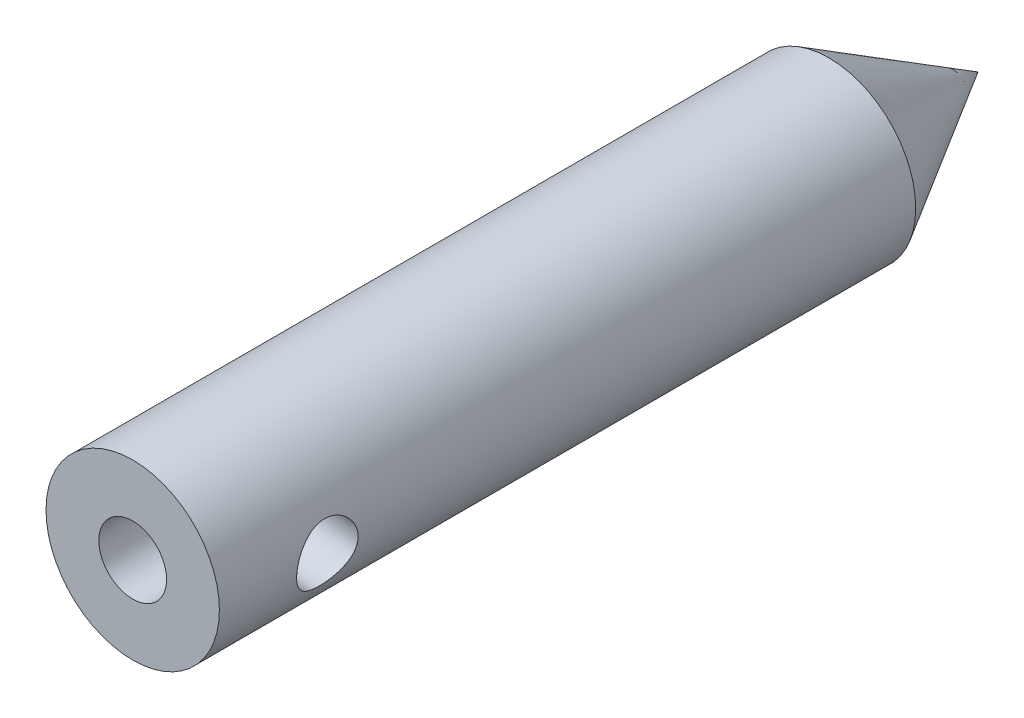
ISO-10303-21;
HEADER;
FILE_DESCRIPTION(('STEP AP214'),'2;1');
FILE_NAME('part.step','',(''),(''),'','','');
FILE_SCHEMA(('AUTOMOTIVE_DESIGN { 1 0 10303 214 1 1 1 1 }'));
ENDSEC;
DATA;
#1=APPLICATION_CONTEXT('core data for automotive mechanical design processes');
#2=APPLICATION_PROTOCOL_DEFINITION('international standard','automotive_design',2000,#1);
#3=PRODUCT_CONTEXT('',#1,'mechanical');
#4=PRODUCT('Part','Part','',(#3));
#5=PRODUCT_RELATED_PRODUCT_CATEGORY('part','',(#4));
#6=PRODUCT_DEFINITION_FORMATION('','',#4);
#7=PRODUCT_DEFINITION_CONTEXT('part definition',#1,'design');
#8=PRODUCT_DEFINITION('design','',#6,#7);
#9=PRODUCT_DEFINITION_SHAPE('','',#8);
#10=(LENGTH_UNIT() NAMED_UNIT(*) SI_UNIT(.MILLI.,.METRE.));
#11=(NAMED_UNIT(*) PLANE_ANGLE_UNIT() SI_UNIT($,.RADIAN.));
#12=(NAMED_UNIT(*) SI_UNIT($,.STERADIAN.) SOLID_ANGLE_UNIT());
#13=UNCERTAINTY_MEASURE_WITH_UNIT(LENGTH_MEASURE(1.E-05),#10,'distance_accuracy_value','');
#14=(GEOMETRIC_REPRESENTATION_CONTEXT(3) GLOBAL_UNCERTAINTY_ASSIGNED_CONTEXT((#13)) GLOBAL_UNIT_ASSIGNED_CONTEXT((#10,
#11,#12)) REPRESENTATION_CONTEXT('',''));
#15=CARTESIAN_POINT('',(0.,0.,0.));
#16=DIRECTION('',(0.,0.,1.));
#17=DIRECTION('',(1.,0.,0.));
#18=AXIS2_PLACEMENT_3D('',#15,#16,#17);
#19=CARTESIAN_POINT('',(0.,0.,25.7));
#20=DIRECTION('',(0.,0.,-1.));
#21=DIRECTION('',(-1.,0.,0.));
#22=AXIS2_PLACEMENT_3D('',#19,#20,#21);
#23=CYLINDRICAL_SURFACE('',#22,3.2);
#24=CARTESIAN_POINT('',(-3.2,0.,22.7944930865436));
#25=CARTESIAN_POINT('',(-3.19999993437462,-0.0617311995361871,22.7786358266463));
#26=CARTESIAN_POINT('',(-3.19819853935474,-0.122137071739955,22.7576172305051));
#27=CARTESIAN_POINT('',(-3.19162977738413,-0.238548511239505,22.7060236217471));
#28=CARTESIAN_POINT('',(-3.18686119831993,-0.294552269708068,22.6754447062204));
#29=CARTESIAN_POINT('',(-3.17527843273258,-0.400558738306911,22.6057548866532));
#30=CARTESIAN_POINT('',(-3.16846834384735,-0.450573191117512,22.5666611158766));
#31=CARTESIAN_POINT('',(-3.15386084267928,-0.543485991389393,22.4809263541348));
#32=CARTESIAN_POINT('',(-3.14606330690951,-0.586383447269194,22.4342844190172));
#33=CARTESIAN_POINT('',(-3.13039055474989,-0.665067091132649,22.333088305801));
#34=CARTESIAN_POINT('',(-3.12251973282401,-0.700608691481398,22.2783426634936));
#35=CARTESIAN_POINT('',(-3.10816086298875,-0.761793206985309,22.1634013496605));
#36=CARTESIAN_POINT('',(-3.1016724958685,-0.787438408345513,22.1032069408469));
#37=CARTESIAN_POINT('',(-3.09127293667315,-0.827314496967705,21.9806264060403));
#38=CARTESIAN_POINT('',(-3.08730040487651,-0.84181905727607,21.9183349377635));
#39=CARTESIAN_POINT('',(-3.08233528176368,-0.859825879396913,21.7920745340401));
#40=CARTESIAN_POINT('',(-3.08134138080551,-0.863332976596517,21.7281063482946));
#41=CARTESIAN_POINT('',(-3.08246406346741,-0.859311185365296,21.6042337795584));
#42=CARTESIAN_POINT('',(-3.08440571866578,-0.852403005411055,21.5443065241799));
#43=CARTESIAN_POINT('',(-3.09078530260908,-0.828970202868143,21.4265058328426));
#44=CARTESIAN_POINT('',(-3.09522342584251,-0.812444831044213,21.3686325572735));
#45=CARTESIAN_POINT('',(-3.10597350952847,-0.770323802041542,21.2562449227704));
#46=CARTESIAN_POINT('',(-3.11229233295177,-0.744694857062636,21.2017437646356));
#47=CARTESIAN_POINT('',(-3.12592915432085,-0.685197682497173,21.0975783194097));
#48=CARTESIAN_POINT('',(-3.13324744667341,-0.651327022898214,21.0479154649175));
#49=CARTESIAN_POINT('',(-3.1483480530381,-0.574055598485578,20.9517557542217));
#50=CARTESIAN_POINT('',(-3.15613250835144,-0.530213820713868,20.9056131265984));
#51=CARTESIAN_POINT('',(-3.17059430050408,-0.435461013309089,20.8210393995617));
#52=CARTESIAN_POINT('',(-3.17727140895548,-0.38454852932673,20.7826098906198));
#53=CARTESIAN_POINT('',(-3.1885912645528,-0.275598417571499,20.7136522421497));
#54=CARTESIAN_POINT('',(-3.19317936010695,-0.217415219203771,20.6833440767924));
#55=CARTESIAN_POINT('',(-3.1991112530944,-0.0966241449688731,20.6329487387164));
#56=CARTESIAN_POINT('',(-3.20045616205574,-0.0340177926106655,20.6128580660491));
#57=CARTESIAN_POINT('',(-3.19929055922512,0.0910175946912793,20.5842874323287));
#58=CARTESIAN_POINT('',(-3.19693828204112,0.153345424552418,20.5753587650775));
#59=CARTESIAN_POINT('',(-3.18848501342895,0.278359729081188,20.5679679509808));
#60=CARTESIAN_POINT('',(-3.18238500538007,0.341046105395387,20.5695030595774));
#61=CARTESIAN_POINT('',(-3.16700139244355,0.462258711908021,20.5826871237017));
#62=CARTESIAN_POINT('',(-3.15786019470076,0.520849687917561,20.5939143154701));
#63=CARTESIAN_POINT('',(-3.13689964178176,0.635004369378329,20.6255053466198));
#64=CARTESIAN_POINT('',(-3.12508005555157,0.690567813143055,20.6458699744002));
#65=CARTESIAN_POINT('',(-3.09933482922577,0.798277511701459,20.6955168321471));
#66=CARTESIAN_POINT('',(-3.08537536577957,0.850345077853432,20.7249517345687));
#67=CARTESIAN_POINT('',(-3.05652989226255,0.948821341350156,20.7917674595073));
#68=CARTESIAN_POINT('',(-3.04164359398435,0.995228265059911,20.8291507624641));
#69=CARTESIAN_POINT('',(-3.0112921146253,1.08370781758369,20.9131103059363));
#70=CARTESIAN_POINT('',(-2.9958376692271,1.12542408337298,20.9600666542337));
#71=CARTESIAN_POINT('',(-2.96651754674407,1.20058543509738,21.060642721257));
#72=CARTESIAN_POINT('',(-2.95265212244238,1.23402920601284,21.1142634973467));
#73=CARTESIAN_POINT('',(-2.92769089356362,1.29214701601769,21.2276174202286));
#74=CARTESIAN_POINT('',(-2.91663423985142,1.3166989257288,21.2874221707784));
#75=CARTESIAN_POINT('',(-2.89877088714497,1.35557786060711,21.4108621533135));
#76=CARTESIAN_POINT('',(-2.89196205397636,1.3699100208615,21.4744954441289));
#77=CARTESIAN_POINT('',(-2.88364418953838,1.38733004175428,21.6001999775739));
#78=CARTESIAN_POINT('',(-2.88187566616754,1.39096876620615,21.6621778168701));
#79=CARTESIAN_POINT('',(-2.88309752691007,1.38843478184487,21.7858784148954));
#80=CARTESIAN_POINT('',(-2.88608708923591,1.38226376731019,21.8476012158273));
#81=CARTESIAN_POINT('',(-2.89628825905857,1.36075206820785,21.9667208111054));
#82=CARTESIAN_POINT('',(-2.90334311256881,1.34575140877667,22.024193322917));
#83=CARTESIAN_POINT('',(-2.92083743506208,1.30734507475733,22.1357075380328));
#84=CARTESIAN_POINT('',(-2.93127759121062,1.28393769362726,22.1897485421269));
#85=CARTESIAN_POINT('',(-2.95503830666448,1.22828964600742,22.295161957122));
#86=CARTESIAN_POINT('',(-2.96845441682057,1.19574315255556,22.3463510961575));
#87=CARTESIAN_POINT('',(-2.99671720877177,1.12303399840695,22.4425632498667));
#88=CARTESIAN_POINT('',(-3.01156435693581,1.08286885066865,22.4875842427154));
#89=CARTESIAN_POINT('',(-3.04227019348381,0.993448266173681,22.5726429211006));
#90=CARTESIAN_POINT('',(-3.05814075819324,0.943823613467417,22.6122895132291));
#91=CARTESIAN_POINT('',(-3.08875996925875,0.838200922665374,22.6825043902758));
#92=CARTESIAN_POINT('',(-3.10350866708314,0.782203177244866,22.7130730918508));
#93=CARTESIAN_POINT('',(-3.1305265635633,0.665831760461699,22.7638694098452));
#94=CARTESIAN_POINT('',(-3.14281925471979,0.605507882388082,22.7841981482272));
#95=CARTESIAN_POINT('',(-3.16415499540695,0.48172521913387,22.8141855420875));
#96=CARTESIAN_POINT('',(-3.1731996810385,0.41826803065573,22.8238495747427));
#97=CARTESIAN_POINT('',(-3.18692490150107,0.295060909785404,22.8318018901157));
#98=CARTESIAN_POINT('',(-3.19188323859494,0.23539253871287,22.8308935109131));
#99=CARTESIAN_POINT('',(-3.19842090894103,0.116762117797029,22.8196630891429));
#100=CARTESIAN_POINT('',(-3.2000000614463,0.0578001059034239,22.8093405430694));
#101=CARTESIAN_POINT('',(-3.2,0.,22.7944930865436));
#102=B_SPLINE_CURVE_WITH_KNOTS('',3,(#24,#25,#26,#27,#28,#29,#30,#31,#32,#33,#34,#35,#36,#37,
#38,#39,#40,#41,#42,#43,#44,#45,#46,#47,#48,#49,#50,#51,#52,#53,#54,#55,#56,#57,#58,#59,#60,#61,
#62,#63,#64,#65,#66,#67,#68,#69,#70,#71,#72,#73,#74,#75,#76,#77,#78,#79,#80,#81,#82,#83,#84,#85,
#86,#87,#88,#89,#90,#91,#92,#93,#94,#95,#96,#97,#98,#99,#100,#101),.UNSPECIFIED.,.T.,.F.,(4,2,2,
2,2,2,2,2,2,2,2,2,2,2,2,2,2,2,2,2,2,2,2,2,2,2,2,2,2,2,2,2,2,2,2,2,2,2,4),(0.,0.190977205855533,
0.382032478372898,0.57270681105123,0.763405012441077,0.95967878911354,1.15590719664651,
1.34714568263114,1.53830007268784,1.71850380909875,1.89872158630996,2.07960524236998,
2.26054229548255,2.452045187326,2.64358752724091,2.83988762588546,3.03612043759161,
3.22418070953734,3.4121916567994,3.5924112515756,3.77264639910621,3.95609834539072,
4.13960762536492,4.33276914089114,4.52596134222482,4.72171451983427,4.91736926848248,
5.1027513171588,5.2881013512532,5.46674178471483,5.6454185022201,5.83098548451374,
6.01661314806614,6.21208885865324,6.40755559591435,6.60105223348223,6.7944512648223,
6.9732573211079,7.15207294119186),.UNSPECIFIED.);
#103=CARTESIAN_POINT('',(-3.2,0.,22.7944930865436));
#104=VERTEX_POINT('',#103);
#105=EDGE_CURVE('E75',#104,#104,#102,.T.);
#106=ORIENTED_EDGE('',*,*,#105,.T.);
#107=EDGE_LOOP('',(#106));
#108=FACE_BOUND('',#107,.T.);
#109=CARTESIAN_POINT('',(3.08175738840726,0.861841864263549,21.7));
#110=CARTESIAN_POINT('',(3.08175651484368,0.861843082405382,21.6386760540217));
#111=CARTESIAN_POINT('',(3.0832130952027,0.856685954913348,21.5773600067072));
#112=CARTESIAN_POINT('',(3.08880716141158,0.836289524152194,21.4565595393788));
#113=CARTESIAN_POINT('',(3.09294482899364,0.821049537434951,21.3970752438128));
#114=CARTESIAN_POINT('',(3.10326177903859,0.781143862734923,21.2817111821773));
#115=CARTESIAN_POINT('',(3.10943665156178,0.756498516638581,21.2258239391545));
#116=CARTESIAN_POINT('',(3.12295049471786,0.698613320374679,21.1188497730618));
#117=CARTESIAN_POINT('',(3.13028976842011,0.66537123123106,21.0677641052696));
#118=CARTESIAN_POINT('',(3.14543241805791,0.589743524332679,20.9695953851951));
#119=CARTESIAN_POINT('',(3.15324261776567,0.547045485797451,20.9227540086867));
#120=CARTESIAN_POINT('',(3.16790690227465,0.454487711054366,20.8365857898212));
#121=CARTESIAN_POINT('',(3.17476081127782,0.404626661457193,20.7972603286492));
#122=CARTESIAN_POINT('',(3.18661796924716,0.297414806317181,20.7261126283346));
#123=CARTESIAN_POINT('',(3.1915601899945,0.239885501159348,20.6945480012759));
#124=CARTESIAN_POINT('',(3.19830374672694,0.120168488347503,20.6415313132755));
#125=CARTESIAN_POINT('',(3.2001060410874,0.0579822081521657,20.6200761681542));
#126=CARTESIAN_POINT('',(3.19988852387152,-0.0666806165956281,20.5887199582199));
#127=CARTESIAN_POINT('',(3.19801391071963,-0.129052816809735,20.578403931468));
#128=CARTESIAN_POINT('',(3.19048783013912,-0.254412317946334,20.5682946512064));
#129=CARTESIAN_POINT('',(3.18483745387257,-0.31739943598244,20.5684983588838));
#130=CARTESIAN_POINT('',(3.17027575467168,-0.439266454247826,20.5791695195987));
#131=CARTESIAN_POINT('',(3.16151874481908,-0.498205170092249,20.589185268122));
#132=CARTESIAN_POINT('',(3.14123375834802,-0.613240233183084,20.6184432797793));
#133=CARTESIAN_POINT('',(3.12970558904291,-0.669336382449154,20.6376861845965));
#134=CARTESIAN_POINT('',(3.1044790226849,-0.778055375884831,20.6850903895635));
#135=CARTESIAN_POINT('',(3.09075270342633,-0.830619147941358,20.7133718622437));
#136=CARTESIAN_POINT('',(3.06224106563081,-0.930252136569935,20.7779482154699));
#137=CARTESIAN_POINT('',(3.04745542973491,-0.977319695339985,20.8142455043005));
#138=CARTESIAN_POINT('',(3.01715685197422,-1.06730348145129,20.8960539447098));
#139=CARTESIAN_POINT('',(3.00164643496536,-1.10987252454041,20.9419484880106));
#140=CARTESIAN_POINT('',(2.97202992939442,-1.18690580512679,21.0405136205239));
#141=CARTESIAN_POINT('',(2.95792411651655,-1.22136845336822,21.0931855353115));
#142=CARTESIAN_POINT('',(2.93223392033621,-1.28183724834896,21.2050300491524));
#143=CARTESIAN_POINT('',(2.920698676606,-1.30768262652924,21.2643013484166));
#144=CARTESIAN_POINT('',(2.90174999125296,-1.34921246366281,21.3869186074051));
#145=CARTESIAN_POINT('',(2.89433456421745,-1.36490181758726,21.4502625879818));
#146=CARTESIAN_POINT('',(2.88476400353687,-1.38501090489278,21.5758415114767));
#147=CARTESIAN_POINT('',(2.88236479086314,-1.38995404349595,21.6379740049359));
#148=CARTESIAN_POINT('',(2.88237124990035,-1.38994134660641,21.7622302915165));
#149=CARTESIAN_POINT('',(2.88477590526623,-1.38498760497747,21.8243540836978));
#150=CARTESIAN_POINT('',(2.89391683871263,-1.36577787972471,21.9442182719182));
#151=CARTESIAN_POINT('',(2.90047502604213,-1.3519040092387,22.0020344760025));
#152=CARTESIAN_POINT('',(2.91708503075749,-1.31567822732537,22.1144123072732));
#153=CARTESIAN_POINT('',(2.92713751368792,-1.29332470073759,22.1689733121335));
#154=CARTESIAN_POINT('',(2.95019703698298,-1.23984314323117,22.2753839083478));
#155=CARTESIAN_POINT('',(2.96329414196464,-1.20843868677343,22.3270747356906));
#156=CARTESIAN_POINT('',(2.99106263265583,-1.1379703566587,22.4244743776935));
#157=CARTESIAN_POINT('',(3.00573453532804,-1.09890396429642,22.4701812169781));
#158=CARTESIAN_POINT('',(3.03627080321124,-1.01158820402906,22.5569217179418));
#159=CARTESIAN_POINT('',(3.05215634041624,-0.962951590751447,22.5975593810468));
#160=CARTESIAN_POINT('',(3.08297718970855,-0.859172600362135,22.6699287754973));
#161=CARTESIAN_POINT('',(3.09791252116956,-0.804030355958935,22.7016606884669));
#162=CARTESIAN_POINT('',(3.12552116627324,-0.688910796748778,22.7550567774161));
#163=CARTESIAN_POINT('',(3.13820632465569,-0.628961368318542,22.7767746964759));
#164=CARTESIAN_POINT('',(3.16041415078533,-0.505666373803693,22.8095656412664));
#165=CARTESIAN_POINT('',(3.16993811665709,-0.442322214187098,22.8206430400104));
#166=CARTESIAN_POINT('',(3.18478881933238,-0.317583447168468,22.8314078385437));
#167=CARTESIAN_POINT('',(3.19030905593031,-0.256260194735239,22.8316607489226));
#168=CARTESIAN_POINT('',(3.197770478114,-0.134175289035274,22.8221920750222));
#169=CARTESIAN_POINT('',(3.19971201648498,-0.0734135809995753,22.8124714740707));
#170=CARTESIAN_POINT('',(3.20022319878396,0.0445963469499583,22.7837187288366));
#171=CARTESIAN_POINT('',(3.19885832310255,0.101890135990527,22.7648732283553));
#172=CARTESIAN_POINT('',(3.19340284319112,0.212748042773136,22.718584005752));
#173=CARTESIAN_POINT('',(3.18931173011346,0.266311462186147,22.6911386789935));
#174=CARTESIAN_POINT('',(3.17893269478324,0.370451616002724,22.627185157032));
#175=CARTESIAN_POINT('',(3.17256425085249,0.420826299481625,22.5903613185513));
#176=CARTESIAN_POINT('',(3.15865380416557,0.51495035262644,22.5092141501746));
#177=CARTESIAN_POINT('',(3.15111140465341,0.558697472507269,22.4648882844113));
#178=CARTESIAN_POINT('',(3.13557744739972,0.640279971905827,22.3675950344792));
#179=CARTESIAN_POINT('',(3.12758104498168,0.677756746041393,22.3143266681999));
#180=CARTESIAN_POINT('',(3.11270606324092,0.743093987218485,22.2020344838641));
#181=CARTESIAN_POINT('',(3.10582737001609,0.770955434452476,22.1430112532491));
#182=CARTESIAN_POINT('',(3.09431911694055,0.815923107651521,22.0210602219681));
#183=CARTESIAN_POINT('',(3.0896800784879,0.833074751477367,21.9581501704255));
#184=CARTESIAN_POINT('',(3.08340038562456,0.856030804361394,21.8301564204081));
#185=CARTESIAN_POINT('',(3.08175831538722,0.861840571635167,21.7650737631205));
#186=CARTESIAN_POINT('',(3.08175738840726,0.861841864263549,21.7));
#187=B_SPLINE_CURVE_WITH_KNOTS('',3,(#109,#110,#111,#112,#113,#114,#115,#116,#117,#118,#119,
#120,#121,#122,#123,#124,#125,#126,#127,#128,#129,#130,#131,#132,#133,#134,#135,#136,#137,#138,
#139,#140,#141,#142,#143,#144,#145,#146,#147,#148,#149,#150,#151,#152,#153,#154,#155,#156,#157,
#158,#159,#160,#161,#162,#163,#164,#165,#166,#167,#168,#169,#170,#171,#172,#173,#174,#175,#176,
#177,#178,#179,#180,#181,#182,#183,#184,#185,#186),.UNSPECIFIED.,.T.,.F.,(4,2,2,2,2,2,2,2,2,2,2,
2,2,2,2,2,2,2,2,2,2,2,2,2,2,2,2,2,2,2,2,2,2,2,2,2,2,2,4),(0.,0.183730233687756,
0.367472922468562,0.550820444792281,0.734215767179361,0.924943140537105,1.11570552986403,
1.31213507037702,1.50850464571413,1.69727566748511,1.88599215968361,2.0664105346041,
2.24684145816109,2.42977875218454,2.61277108313774,2.80536063593982,2.99798791444409,
3.19403050154351,3.38997853011214,3.57614637318476,3.76227483325858,3.94091790598937,
4.11959502281621,4.3044441952815,4.48935423530429,4.68444786797143,4.87953752160763,
5.07356762011039,5.26751794246732,5.45132251056732,5.63510895839098,5.81528554523096,
5.99549577115094,6.18283689090832,6.37024146345261,6.56615501045664,6.76204858000725,
6.9571056642547,7.15207057582932),.UNSPECIFIED.);
#188=CARTESIAN_POINT('',(3.08175738840726,0.861841864263549,21.7));
#189=VERTEX_POINT('',#188);
#190=EDGE_CURVE('E79',#189,#189,#187,.T.);
#191=ORIENTED_EDGE('',*,*,#190,.T.);
#192=EDGE_LOOP('',(#191));
#193=FACE_BOUND('',#192,.T.);
#194=CARTESIAN_POINT('',(0.,0.,25.7));
#195=DIRECTION('',(0.,0.,1.));
#196=DIRECTION('',(1.,0.,0.));
#197=AXIS2_PLACEMENT_3D('',#194,#195,#196);
#198=CIRCLE('',#197,3.2);
#199=CARTESIAN_POINT('',(3.2,0.,25.7));
#200=VERTEX_POINT('',#199);
#201=EDGE_CURVE('E11',#200,#200,#198,.T.);
#202=ORIENTED_EDGE('',*,*,#201,.F.);
#203=EDGE_LOOP('',(#202));
#204=FACE_BOUND('',#203,.T.);
#205=CARTESIAN_POINT('',(0.,0.,0.));
#206=DIRECTION('',(0.,0.,-1.));
#207=DIRECTION('',(-1.,0.,0.));
#208=AXIS2_PLACEMENT_3D('',#205,#206,#207);
#209=CIRCLE('',#208,3.2);
#210=CARTESIAN_POINT('',(-3.2,0.,0.));
#211=VERTEX_POINT('',#210);
#212=EDGE_CURVE('E83',#211,#211,#209,.T.);
#213=ORIENTED_EDGE('',*,*,#212,.F.);
#214=EDGE_LOOP('',(#213));
#215=FACE_BOUND('',#214,.T.);
#216=ADVANCED_FACE('F32',(#108,#193,#204,#215),#23,.T.);
#217=CARTESIAN_POINT('',(0.,0.,25.7));
#218=DIRECTION('',(0.,0.,1.));
#219=DIRECTION('',(1.,0.,0.));
#220=AXIS2_PLACEMENT_3D('',#217,#218,#219);
#221=PLANE('',#220);
#222=CARTESIAN_POINT('',(0.,0.,25.7));
#223=DIRECTION('',(0.,0.,1.));
#224=DIRECTION('',(1.,0.,0.));
#225=AXIS2_PLACEMENT_3D('',#222,#223,#224);
#226=CIRCLE('',#225,1.25);
#227=CARTESIAN_POINT('',(1.25,0.,25.7));
#228=VERTEX_POINT('',#227);
#229=EDGE_CURVE('E45',#228,#228,#226,.F.);
#230=ORIENTED_EDGE('',*,*,#229,.T.);
#231=EDGE_LOOP('',(#230));
#232=FACE_BOUND('',#231,.T.);
#233=ORIENTED_EDGE('',*,*,#201,.T.);
#234=EDGE_LOOP('',(#233));
#235=FACE_BOUND('',#234,.T.);
#236=ADVANCED_FACE('F66',(#232,#235),#221,.T.);
#237=CARTESIAN_POINT('',(0.,0.,25.700012));
#238=DIRECTION('',(0.,0.,-1.));
#239=DIRECTION('',(-1.,0.,0.));
#240=AXIS2_PLACEMENT_3D('',#237,#238,#239);
#241=CYLINDRICAL_SURFACE('',#240,1.25);
#242=CARTESIAN_POINT('',(-1.25,0.,22.8249099896932));
#243=CARTESIAN_POINT('',(-1.24999766705177,-0.0551815359045936,22.8195204038883));
#244=CARTESIAN_POINT('',(-1.24631458752326,-0.10998161058515,22.8101060728636));
#245=CARTESIAN_POINT('',(-1.23222070007497,-0.216917236866035,22.7840040048006));
#246=CARTESIAN_POINT('',(-1.22180180909992,-0.269049505848772,22.7673075369527));
#247=CARTESIAN_POINT('',(-1.19542795355947,-0.368916341536385,22.7279366486313));
#248=CARTESIAN_POINT('',(-1.17952026239871,-0.416684192210315,22.7053136596687));
#249=CARTESIAN_POINT('',(-1.1433121349507,-0.507680268432885,22.6551062965214));
#250=CARTESIAN_POINT('',(-1.12301056603782,-0.550907319207746,22.627520643403));
#251=CARTESIAN_POINT('',(-1.06883916382848,-0.651699754722712,22.5544083964047));
#252=CARTESIAN_POINT('',(-1.03306187372302,-0.706527168929677,22.5065215034988));
#253=CARTESIAN_POINT('',(-0.957505728082901,-0.805967660243836,22.4036472737409));
#254=CARTESIAN_POINT('',(-0.917716611536683,-0.850553537474866,22.3486416220338));
#255=CARTESIAN_POINT('',(-0.846212211626877,-0.921082045542983,22.2442197704254));
#256=CARTESIAN_POINT('',(-0.81455721966739,-0.948973509713359,22.1960577573116));
#257=CARTESIAN_POINT('',(-0.753777340604263,-0.997902681526937,22.0949041169427));
#258=CARTESIAN_POINT('',(-0.724644382042338,-1.01896289492468,22.0419291002113));
#259=CARTESIAN_POINT('',(-0.686834507212692,-1.04451197747982,21.9572805503099));
#260=CARTESIAN_POINT('',(-0.675136157478509,-1.05206062279447,21.9279157932406));
#261=CARTESIAN_POINT('',(-0.65518982991599,-1.06459541311981,21.8675284126356));
#262=CARTESIAN_POINT('',(-0.646933595489726,-1.06958769672087,21.8365099599613));
#263=CARTESIAN_POINT('',(-0.635225578203529,-1.07658750869035,21.7726860933086));
#264=CARTESIAN_POINT('',(-0.631848426229311,-1.07854870415682,21.7398607349414));
#265=CARTESIAN_POINT('',(-0.631029163409725,-1.07902868568066,21.6741208926836));
#266=CARTESIAN_POINT('',(-0.633584298561767,-1.07754906909872,21.6412064572318));
#267=CARTESIAN_POINT('',(-0.644376433095751,-1.07112862028581,21.5738278383874));
#268=CARTESIAN_POINT('',(-0.653080143199619,-1.0659029212663,21.5394714456879));
#269=CARTESIAN_POINT('',(-0.67474341746402,-1.05232383591715,21.4727243674744));
#270=CARTESIAN_POINT('',(-0.687721088784408,-1.04395712080921,21.4403427524034));
#271=CARTESIAN_POINT('',(-0.728310599826002,-1.0163949350346,21.3507099683483));
#272=CARTESIAN_POINT('',(-0.758953322673008,-0.994054547464156,21.2958441999379));
#273=CARTESIAN_POINT('',(-0.822623653338357,-0.942079333215525,21.1912857511815));
#274=CARTESIAN_POINT('',(-0.855656082107026,-0.912429453208225,21.1416040513921));
#275=CARTESIAN_POINT('',(-0.925080849678809,-0.842280040854744,21.041195730931));
#276=CARTESIAN_POINT('',(-0.96141521214483,-0.800917960426087,20.9910242937395));
#277=CARTESIAN_POINT('',(-1.03071191595909,-0.709522206207142,20.8966831135723));
#278=CARTESIAN_POINT('',(-1.06367956568855,-0.659502529520231,20.852503885267));
#279=CARTESIAN_POINT('',(-1.11821274258195,-0.560940029469903,20.7789870943652));
#280=CARTESIAN_POINT('',(-1.14075785688939,-0.51386575323452,20.7484186150589));
#281=CARTESIAN_POINT('',(-1.18056989380048,-0.414270817208163,20.6932471239372));
#282=CARTESIAN_POINT('',(-1.19784258667666,-0.361756196420525,20.6686375966376));
#283=CARTESIAN_POINT('',(-1.2233553367811,-0.26104738559215,20.6301821987639));
#284=CARTESIAN_POINT('',(-1.23260562646096,-0.213532403749094,20.6152382652744));
#285=CARTESIAN_POINT('',(-1.2455443487052,-0.116274672979407,20.591363773337));
#286=CARTESIAN_POINT('',(-1.24923643525018,-0.0665334097874841,20.5824292664122));
#287=CARTESIAN_POINT('',(-1.25055180864942,0.0339947629999644,20.5711613870473));
#288=CARTESIAN_POINT('',(-1.24815049612079,0.0847850873840869,20.5688548521826));
#289=CARTESIAN_POINT('',(-1.23719125384526,0.185541355831951,20.5710995128356));
#290=CARTESIAN_POINT('',(-1.22863331752434,0.235507299015362,20.5756507156762));
#291=CARTESIAN_POINT('',(-1.20659301851028,0.329897469331721,20.5907572931726));
#292=CARTESIAN_POINT('',(-1.1934630529368,0.374471390087605,20.6009073738735));
#293=CARTESIAN_POINT('',(-1.16295014611513,0.460583600594371,20.6263096035679));
#294=CARTESIAN_POINT('',(-1.14556586769604,0.502120930574595,20.641563357249));
#295=CARTESIAN_POINT('',(-1.10073142833747,0.595321086967081,20.6825127822406));
#296=CARTESIAN_POINT('',(-1.07187861929662,0.645524441063555,20.7099952942883));
#297=CARTESIAN_POINT('',(-1.0098097292542,0.738879285903796,20.7713246194994));
#298=CARTESIAN_POINT('',(-0.976584195876116,0.782015031880081,20.8051852905369));
#299=CARTESIAN_POINT('',(-0.89663437233689,0.873679325026911,20.8894385050212));
#300=CARTESIAN_POINT('',(-0.848946309894067,0.91965134437438,20.9416842151007));
#301=CARTESIAN_POINT('',(-0.752444164753941,1.00012690507553,21.0534339068907));
#302=CARTESIAN_POINT('',(-0.703629566698305,1.03462508161267,21.1129412662005));
#303=CARTESIAN_POINT('',(-0.628119406798204,1.08124612936344,21.2145037341198));
#304=CARTESIAN_POINT('',(-0.60030044328334,1.09682546268303,21.2541726640534));
#305=CARTESIAN_POINT('',(-0.547762235956309,1.1239744216787,21.3368251302961));
#306=CARTESIAN_POINT('',(-0.523037490070496,1.13555123110659,21.3798025571331));
#307=CARTESIAN_POINT('',(-0.487508246768452,1.15111873232478,21.4540740108946));
#308=CARTESIAN_POINT('',(-0.474857994912563,1.15634677627243,21.4842058449939));
#309=CARTESIAN_POINT('',(-0.453772050816169,1.16478360190095,21.5461689545842));
#310=CARTESIAN_POINT('',(-0.445324758555755,1.16799794775114,21.5779952811764));
#311=CARTESIAN_POINT('',(-0.435008771962641,1.17187663048995,21.6380480250995));
#312=CARTESIAN_POINT('',(-0.432354346035139,1.17284683619345,21.666114181722));
#313=CARTESIAN_POINT('',(-0.431722399989004,1.1730797135664,21.7222965252052));
#314=CARTESIAN_POINT('',(-0.433742888637079,1.17234311223312,21.7504126856699));
#315=CARTESIAN_POINT('',(-0.443039533160738,1.16886447477694,21.8122532136299));
#316=CARTESIAN_POINT('',(-0.451416139902315,1.16570072066343,21.8457826071132));
#317=CARTESIAN_POINT('',(-0.472918231355275,1.15714364798838,21.9110272723145));
#318=CARTESIAN_POINT('',(-0.486063458868387,1.15174104683202,21.9427343577707));
#319=CARTESIAN_POINT('',(-0.527330597543005,1.13368837816508,22.0294741713973));
#320=CARTESIAN_POINT('',(-0.558900664743808,1.1187265978726,22.082340795947));
#321=CARTESIAN_POINT('',(-0.625918369164334,1.08268294605707,22.1832255445707));
#322=CARTESIAN_POINT('',(-0.661374748686938,1.06158709222973,22.2312322498461));
#323=CARTESIAN_POINT('',(-0.737881548812778,1.01015391677746,22.3288485576972));
#324=CARTESIAN_POINT('',(-0.779079163901509,0.978993417558039,22.3779146268742));
#325=CARTESIAN_POINT('',(-0.860327149717558,0.908424640720194,22.4706984641354));
#326=CARTESIAN_POINT('',(-0.900378931724004,0.869027053716868,22.5144230493296));
#327=CARTESIAN_POINT('',(-0.97276026413447,0.786689134235327,22.5908528321253));
#328=CARTESIAN_POINT('',(-1.00544411813692,0.74470971624516,22.624249176284));
#329=CARTESIAN_POINT('',(-1.06672350965243,0.653904362061103,22.6850069755893));
#330=CARTESIAN_POINT('',(-1.09532307349607,0.605085263890362,22.7123743887593));
#331=CARTESIAN_POINT('',(-1.14206672423938,0.510348763706111,22.7553522592062));
#332=CARTESIAN_POINT('',(-1.16116577076797,0.465463427798125,22.7721885931444));
#333=CARTESIAN_POINT('',(-1.19434807994418,0.372125084595156,22.7998452463546));
#334=CARTESIAN_POINT('',(-1.20843663158791,0.323675904845339,22.8106719161423));
#335=CARTESIAN_POINT('',(-1.22960460238112,0.229479954522564,22.824830236892));
#336=CARTESIAN_POINT('',(-1.23725059961336,0.183958532334338,22.8288114697595));
#337=CARTESIAN_POINT('',(-1.24744952145044,0.0922032111454693,22.8310965363696));
#338=CARTESIAN_POINT('',(-1.25000194347367,0.0459692422915582,22.8293998099138));
#339=CARTESIAN_POINT('',(-1.25,0.,22.8249099896932));
#340=B_SPLINE_CURVE_WITH_KNOTS('',3,(#242,#243,#244,#245,#246,#247,#248,#249,#250,#251,#252,
#253,#254,#255,#256,#257,#258,#259,#260,#261,#262,#263,#264,#265,#266,#267,#268,#269,#270,#271,
#272,#273,#274,#275,#276,#277,#278,#279,#280,#281,#282,#283,#284,#285,#286,#287,#288,#289,#290,
#291,#292,#293,#294,#295,#296,#297,#298,#299,#300,#301,#302,#303,#304,#305,#306,#307,#308,#309,
#310,#311,#312,#313,#314,#315,#316,#317,#318,#319,#320,#321,#322,#323,#324,#325,#326,#327,#328,
#329,#330,#331,#332,#333,#334,#335,#336,#337,#338,#339),.UNSPECIFIED.,.T.,.F.,(4,2,2,2,2,2,2,2,
2,2,2,2,2,2,2,2,2,2,2,2,2,2,2,2,2,2,2,2,2,2,2,2,2,2,2,2,2,2,2,2,2,2,2,2,2,2,2,2,4),(0.,
0.166119742557825,0.332439201768996,0.497360551577222,0.662324464494653,0.904368503787049,
1.14704812638669,1.3387342439515,1.5297822758309,1.62704728011914,1.72407761361462,
1.82257696712857,1.92103060248627,2.02789432790832,2.13521674739339,2.33421919590065,
2.53363494911415,2.75633227386186,2.97867286129757,3.15949282853911,3.34011418634298,
3.49146173712479,3.64270974802504,3.79456932594541,3.94642906602115,4.08851480395392,
4.23064525826977,4.42187803435475,4.6135311986982,4.86533567105296,5.11725771446983,
5.26971162741216,5.42189047721458,5.52091734142743,5.61966935754279,5.70387550421574,
5.7880457907225,5.89154667208534,5.99548104657371,6.18454467952638,6.37404269775306,
6.58711450356542,6.79991146908914,6.98769300797852,7.17528813299711,7.32946822315145,
7.4834850768697,7.62185827000746,7.76024511571352),.UNSPECIFIED.);
#341=CARTESIAN_POINT('',(-1.25,0.,22.8249099896932));
#342=VERTEX_POINT('',#341);
#343=EDGE_CURVE('E36',#342,#342,#340,.T.);
#344=ORIENTED_EDGE('',*,*,#343,.F.);
#345=EDGE_LOOP('',(#344));
#346=FACE_BOUND('',#345,.T.);
#347=CARTESIAN_POINT('',(0.63139510365614,1.07881426718368,21.7));
#348=CARTESIAN_POINT('',(0.631406086799474,1.07881006400974,21.6665881487352));
#349=CARTESIAN_POINT('',(0.634470565941619,1.07703139595881,21.6331269587516));
#350=CARTESIAN_POINT('',(0.645936270411954,1.07018966699341,21.567453492381));
#351=CARTESIAN_POINT('',(0.654358715926392,1.06511354483873,21.5352467248329));
#352=CARTESIAN_POINT('',(0.679876493838067,1.04908747516453,21.4573624788377));
#353=CARTESIAN_POINT('',(0.699198723837525,1.03647936771643,21.4127925482654));
#354=CARTESIAN_POINT('',(0.7417117506985,1.0065030257001,21.3272169733591));
#355=CARTESIAN_POINT('',(0.764918070081929,0.989115503868187,21.2862266772079));
#356=CARTESIAN_POINT('',(0.809646633494107,0.952729401296232,21.2124582049792));
#357=CARTESIAN_POINT('',(0.830985937544041,0.934247683725995,21.1793107684249));
#358=CARTESIAN_POINT('',(0.873874205661167,0.894263159471011,21.1150270413236));
#359=CARTESIAN_POINT('',(0.895423296634419,0.872758402768643,21.083892067995));
#360=CARTESIAN_POINT('',(0.959301675811316,0.803833033630456,20.9934595563921));
#361=CARTESIAN_POINT('',(1.00096779906769,0.751920456247856,20.9369728061296));
#362=CARTESIAN_POINT('',(1.06878448182887,0.650365514566128,20.8455521196645));
#363=CARTESIAN_POINT('',(1.09623616984773,0.603279099141561,20.8087273308318));
#364=CARTESIAN_POINT('',(1.14596355150902,0.502406418707241,20.741261657141));
#365=CARTESIAN_POINT('',(1.16824816529282,0.448631949973873,20.7106101273281));
#366=CARTESIAN_POINT('',(1.20204592466345,0.346254352560321,20.6623843846029));
#367=CARTESIAN_POINT('',(1.214816819258,0.29872435852894,20.6434231891411));
#368=CARTESIAN_POINT('',(1.23481918957689,0.200558558967746,20.6114956507936));
#369=CARTESIAN_POINT('',(1.24205397952382,0.149924631269535,20.5985257230454));
#370=CARTESIAN_POINT('',(1.2502148622528,0.0465342345007566,20.5793899608022));
#371=CARTESIAN_POINT('',(1.25110214316782,-0.00623331200119741,20.5732661787634));
#372=CARTESIAN_POINT('',(1.24611060229248,-0.111785781479433,20.5684678754195));
#373=CARTESIAN_POINT('',(1.24023412781571,-0.164570692075721,20.5697907704172));
#374=CARTESIAN_POINT('',(1.22291800611341,-0.263106313210855,20.5792628129262));
#375=CARTESIAN_POINT('',(1.2120886671946,-0.309035065303505,20.5867211320157));
#376=CARTESIAN_POINT('',(1.18577302891271,-0.398255035702582,20.6070997075687));
#377=CARTESIAN_POINT('',(1.17028576915591,-0.441545707860464,20.6200210906574));
#378=CARTESIAN_POINT('',(1.13451733447584,-0.526900694537679,20.6514552456739));
#379=CARTESIAN_POINT('',(1.11402666133263,-0.568780384435068,20.6702266254764));
#380=CARTESIAN_POINT('',(1.06971807826969,-0.648289422622322,20.7122273422261));
#381=CARTESIAN_POINT('',(1.04589902829441,-0.685917306537019,20.7354582076864));
#382=CARTESIAN_POINT('',(0.982625908292095,-0.775453326511859,20.7988586801712));
#383=CARTESIAN_POINT('',(0.941538664732038,-0.824460296545385,20.8415100950393));
#384=CARTESIAN_POINT('',(0.856384552473033,-0.912626992729475,20.9336957991131));
#385=CARTESIAN_POINT('',(0.812306986597543,-0.951748714647172,20.9832555484354));
#386=CARTESIAN_POINT('',(0.722811730351494,-1.02142409931331,21.0896743571943));
#387=CARTESIAN_POINT('',(0.677387723263707,-1.05174361265856,21.1466828491613));
#388=CARTESIAN_POINT('',(0.612351338952513,-1.09002979916206,21.2372466593177));
#389=CARTESIAN_POINT('',(0.591213906071037,-1.10158293861974,21.2682341159677));
#390=CARTESIAN_POINT('',(0.550881581514126,-1.12229158802772,21.332191079129));
#391=CARTESIAN_POINT('',(0.531683982082798,-1.13145046922774,21.3651577174765));
#392=CARTESIAN_POINT('',(0.499354312177508,-1.14604122771532,21.4281540511417));
#393=CARTESIAN_POINT('',(0.485743355320031,-1.15183039539312,21.4578498288184));
#394=CARTESIAN_POINT('',(0.462290036112587,-1.16144275849501,21.5189779435316));
#395=CARTESIAN_POINT('',(0.452437601670805,-1.16527121780466,21.5504053773723));
#396=CARTESIAN_POINT('',(0.439152389147106,-1.17033747042575,21.6099394749665));
#397=CARTESIAN_POINT('',(0.43498591883889,-1.17187457030747,21.6378502648842));
#398=CARTESIAN_POINT('',(0.431279636247604,-1.17324461350383,21.6940164267627));
#399=CARTESIAN_POINT('',(0.431736213813253,-1.17307888655929,21.7222715126415));
#400=CARTESIAN_POINT('',(0.437167826028402,-1.17106398056847,21.7781640515148));
#401=CARTESIAN_POINT('',(0.44212807673628,-1.16922030956295,21.8058032223946));
#402=CARTESIAN_POINT('',(0.455735278082533,-1.16398379532866,21.8600130574579));
#403=CARTESIAN_POINT('',(0.464388911640815,-1.16058814310439,21.8865816887352));
#404=CARTESIAN_POINT('',(0.492867666502176,-1.1488999441174,21.9605471623281));
#405=CARTESIAN_POINT('',(0.515928445341877,-1.13890034560632,22.0063982860617));
#406=CARTESIAN_POINT('',(0.566550517739289,-1.11459458316072,22.0943867113505));
#407=CARTESIAN_POINT('',(0.594133048989225,-1.10026781421014,22.1365049683744));
#408=CARTESIAN_POINT('',(0.646697059995486,-1.07007035038371,22.2110573223));
#409=CARTESIAN_POINT('',(0.671379606886775,-1.05482227098532,22.2439571279463));
#410=CARTESIAN_POINT('',(0.721312083071841,-1.02133038867222,22.3077459968004));
#411=CARTESIAN_POINT('',(0.746562349432553,-1.00308476321963,22.338633820648));
#412=CARTESIAN_POINT('',(0.822106196386555,-0.943780647678622,22.4282513093165));
#413=CARTESIAN_POINT('',(0.872335354020228,-0.898078484540632,22.4841250667296));
#414=CARTESIAN_POINT('',(0.955476574732602,-0.807634171727777,22.5729077130363));
#415=CARTESIAN_POINT('',(0.989420351110487,-0.765921190935781,22.6079569396222));
#416=CARTESIAN_POINT('',(1.05330924799653,-0.675347637301339,22.6719593343352));
#417=CARTESIAN_POINT('',(1.08326081865307,-0.626498868060979,22.7009223805706));
#418=CARTESIAN_POINT('',(1.13224906900439,-0.531790974744535,22.7465095115492));
#419=CARTESIAN_POINT('',(1.15227959353672,-0.487073310953839,22.7644274085619));
#420=CARTESIAN_POINT('',(1.18738224461305,-0.393825372446461,22.7942605109879));
#421=CARTESIAN_POINT('',(1.20245732998396,-0.345297394342334,22.8061793006553));
#422=CARTESIAN_POINT('',(1.22677266158918,-0.245330832399517,22.8232576123402));
#423=CARTESIAN_POINT('',(1.23597989374775,-0.19387752377832,22.8283790622774));
#424=CARTESIAN_POINT('',(1.24784851547718,-0.0900175886570055,22.8313229940641));
#425=CARTESIAN_POINT('',(1.25051157407318,-0.037611208663689,22.8291473373013));
#426=CARTESIAN_POINT('',(1.24937788240096,0.0615695924979349,22.8182115318105));
#427=CARTESIAN_POINT('',(1.2461470658696,0.10842245057428,22.810068756601));
#428=CARTESIAN_POINT('',(1.23472637474606,0.200231032333893,22.788420239751));
#429=CARTESIAN_POINT('',(1.22653529112555,0.245186290632698,22.7749131908849));
#430=CARTESIAN_POINT('',(1.20518411754267,0.33511445629895,22.7422146950175));
#431=CARTESIAN_POINT('',(1.19174140038664,0.379907034150743,22.722716627481));
#432=CARTESIAN_POINT('',(1.16087793664979,0.465777456251827,22.6792910050963));
#433=CARTESIAN_POINT('',(1.14345617125151,0.506854345348632,22.6553623161049));
#434=CARTESIAN_POINT('',(1.09533101798719,0.60596546761109,22.5900104219047));
#435=CARTESIAN_POINT('',(1.06250679947612,0.661323251776867,22.5460740559417));
#436=CARTESIAN_POINT('',(0.992319712582519,0.76264591429067,22.4512371717144));
#437=CARTESIAN_POINT('',(0.954937702685058,0.808568840704255,22.4003071605893));
#438=CARTESIAN_POINT('',(0.877594111598888,0.891968540418102,22.2909237894615));
#439=CARTESIAN_POINT('',(0.837591318949885,0.929204149682238,22.232313571899));
#440=CARTESIAN_POINT('',(0.779999522442466,0.977103536952057,22.1390617244635));
#441=CARTESIAN_POINT('',(0.761232607550177,0.991727146323254,22.1071440111792));
#442=CARTESIAN_POINT('',(0.725553703248698,1.01811525653311,22.0411856750335));
#443=CARTESIAN_POINT('',(0.708638407800881,1.02988490031976,22.0071490118648));
#444=CARTESIAN_POINT('',(0.680638856676645,1.04855591819342,21.9420624579142));
#445=CARTESIAN_POINT('',(0.669057082429567,1.05592931127405,21.911368609514));
#446=CARTESIAN_POINT('',(0.649914479887341,1.06782067133315,21.848272830384));
#447=CARTESIAN_POINT('',(0.642335360874509,1.07235164533513,21.8158794263721));
#448=CARTESIAN_POINT('',(0.635501393794343,1.07640275430009,21.7692610687238));
#449=CARTESIAN_POINT('',(0.633970053580031,1.07730391507321,21.7554728878422));
#450=CARTESIAN_POINT('',(0.631914487559504,1.07851062643269,21.7277926693365));
#451=CARTESIAN_POINT('',(0.631390534249558,1.07881601586436,21.7139006046319));
#452=CARTESIAN_POINT('',(0.63139510365614,1.07881426718368,21.7));
#453=B_SPLINE_CURVE_WITH_KNOTS('',3,(#347,#348,#349,#350,#351,#352,#353,#354,#355,#356,#357,
#358,#359,#360,#361,#362,#363,#364,#365,#366,#367,#368,#369,#370,#371,#372,#373,#374,#375,#376,
#377,#378,#379,#380,#381,#382,#383,#384,#385,#386,#387,#388,#389,#390,#391,#392,#393,#394,#395,
#396,#397,#398,#399,#400,#401,#402,#403,#404,#405,#406,#407,#408,#409,#410,#411,#412,#413,#414,
#415,#416,#417,#418,#419,#420,#421,#422,#423,#424,#425,#426,#427,#428,#429,#430,#431,#432,#433,
#434,#435,#436,#437,#438,#439,#440,#441,#442,#443,#444,#445,#446,#447,#448,#449,#450,#451,#452),
.UNSPECIFIED.,.T.,.F.,(4,2,2,2,2,2,2,2,2,2,2,2,2,2,2,2,2,2,2,2,2,2,2,2,2,2,2,2,2,2,2,2,2,2,2,2,
2,2,2,2,2,2,2,2,2,2,2,2,2,2,2,2,4),(0.,0.100166933090852,0.200733067562164,0.350439261370254,
0.50075869392393,0.631205843134386,0.761737526990558,1.02217966164686,1.21885734903947,
1.4151929324692,1.57278972278808,1.73029209286218,1.88875669500763,2.04716631970845,
2.18984727302299,2.33255766521077,2.48278309593021,2.63306010947264,2.8623937954257,
3.09259619008198,3.32845498665749,3.44608751621487,3.56355350939582,3.66285880457902,
3.76189607999421,3.84629305171011,3.93062412267593,4.01467936193975,4.09888734245757,
4.25485801358003,4.41158341550814,4.54300789901276,4.67451258766668,4.93678156545321,
5.12871856382551,5.32034159287646,5.47622744278355,5.63202004553378,5.78868161518829,
5.94530322574867,6.08766849728227,6.23006848327026,6.38151535544508,6.53300104847163,
6.76548327847919,6.99897787236859,7.23833825524201,7.35763492444806,7.47671499199548,
7.57731780934263,7.67745684014869,7.71911883730662,7.76079210237206),.UNSPECIFIED.);
#454=CARTESIAN_POINT('',(0.63139510365614,1.07881426718368,21.7));
#455=VERTEX_POINT('',#454);
#456=EDGE_CURVE('E95',#455,#455,#453,.T.);
#457=ORIENTED_EDGE('',*,*,#456,.F.);
#458=EDGE_LOOP('',(#457));
#459=FACE_BOUND('',#458,.T.);
#460=ORIENTED_EDGE('',*,*,#229,.F.);
#461=EDGE_LOOP('',(#460));
#462=FACE_BOUND('',#461,.T.);
#463=CARTESIAN_POINT('',(0.,0.,0.));
#464=DIRECTION('',(0.,0.,1.));
#465=DIRECTION('',(1.,0.,0.));
#466=AXIS2_PLACEMENT_3D('',#463,#464,#465);
#467=CIRCLE('',#466,1.25);
#468=CARTESIAN_POINT('',(1.25,0.,0.));
#469=VERTEX_POINT('',#468);
#470=EDGE_CURVE('E84',#469,#469,#467,.T.);
#471=ORIENTED_EDGE('',*,*,#470,.F.);
#472=EDGE_LOOP('',(#471));
#473=FACE_BOUND('',#472,.T.);
#474=ADVANCED_FACE('F61',(#346,#459,#462,#473),#241,.F.);
#475=CARTESIAN_POINT('',(0.,0.,0.));
#476=DIRECTION('',(0.,0.,1.));
#477=DIRECTION('',(1.,0.,0.));
#478=AXIS2_PLACEMENT_3D('',#475,#476,#477);
#479=PLANE('',#478);
#480=ORIENTED_EDGE('',*,*,#470,.T.);
#481=EDGE_LOOP('',(#480));
#482=FACE_BOUND('',#481,.T.);
#483=ADVANCED_FACE('F52',(#482),#479,.T.);
#484=CARTESIAN_POINT('',(0.,0.,-5.5));
#485=DIRECTION('',(0.,0.,1.));
#486=DIRECTION('',(1.,0.,0.));
#487=AXIS2_PLACEMENT_3D('',#484,#485,#486);
#488=CONICAL_SURFACE('',#487,0.,0.52694322718943);
#489=ORIENTED_EDGE('',*,*,#212,.T.);
#490=EDGE_LOOP('',(#489));
#491=FACE_BOUND('',#490,.T.);
#492=CARTESIAN_POINT('',(0.,0.,-5.5));
#493=VERTEX_POINT('',#492);
#494=VERTEX_LOOP('',#493);
#495=FACE_BOUND('',#494,.T.);
#496=ADVANCED_FACE('F49',(#491,#495),#488,.T.);
#497=CARTESIAN_POINT('',(3.1875283569706,-0.282246299370463,21.7));
#498=DIRECTION('',(0.996102611553312,-0.0882019685532694,0.));
#499=DIRECTION('',(0.0882019685532694,0.996102611553312,0.));
#500=AXIS2_PLACEMENT_3D('',#497,#498,#499);
#501=CYLINDRICAL_SURFACE('',#500,1.1303);
#502=ORIENTED_EDGE('',*,*,#456,.T.);
#503=EDGE_LOOP('',(#502));
#504=FACE_BOUND('',#503,.T.);
#505=ORIENTED_EDGE('',*,*,#190,.F.);
#506=EDGE_LOOP('',(#505));
#507=FACE_BOUND('',#506,.T.);
#508=ADVANCED_FACE('F51',(#504,#507),#501,.F.);
#509=ORIENTED_EDGE('',*,*,#343,.T.);
#510=EDGE_LOOP('',(#509));
#511=FACE_BOUND('',#510,.T.);
#512=ORIENTED_EDGE('',*,*,#105,.F.);
#513=EDGE_LOOP('',(#512));
#514=FACE_BOUND('',#513,.T.);
#515=ADVANCED_FACE('F59',(#511,#514),#501,.F.);
#516=CLOSED_SHELL('',(#216,#236,#474,#483,#496,#508,#515));
#517=MANIFOLD_SOLID_BREP('B2',#516);
#518=ADVANCED_BREP_SHAPE_REPRESENTATION('',(#18,#517),#14);
#519=SHAPE_DEFINITION_REPRESENTATION(#9,#518);
ENDSEC;
END-ISO-10303-21;
